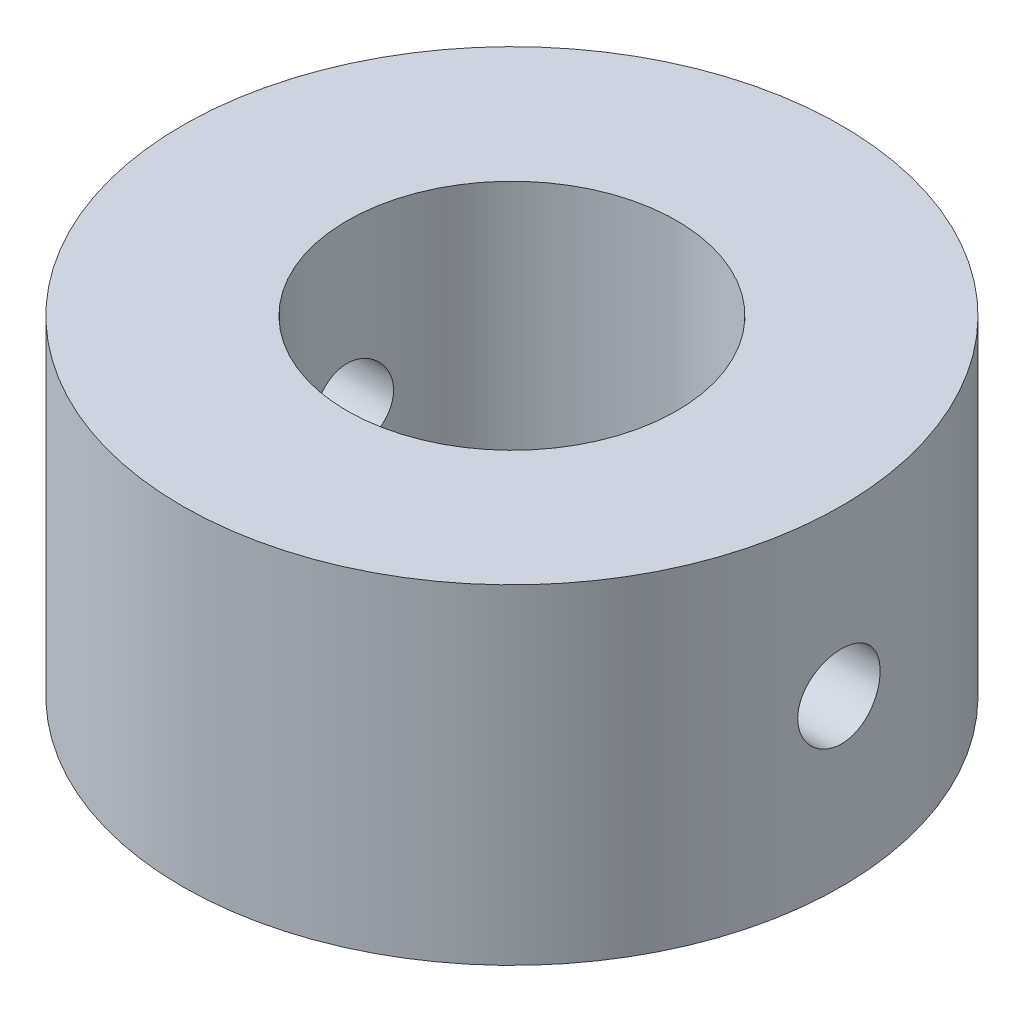
ISO-10303-21;
HEADER;
FILE_DESCRIPTION(('STEP AP214'),'2;1');
FILE_NAME('part.step','',(''),(''),'','','');
FILE_SCHEMA(('AUTOMOTIVE_DESIGN { 1 0 10303 214 1 1 1 1 }'));
ENDSEC;
DATA;
#1=APPLICATION_CONTEXT('core data for automotive mechanical design processes');
#2=APPLICATION_PROTOCOL_DEFINITION('international standard','automotive_design',2000,#1);
#3=PRODUCT_CONTEXT('',#1,'mechanical');
#4=PRODUCT('Part','Part','',(#3));
#5=PRODUCT_RELATED_PRODUCT_CATEGORY('part','',(#4));
#6=PRODUCT_DEFINITION_FORMATION('','',#4);
#7=PRODUCT_DEFINITION_CONTEXT('part definition',#1,'design');
#8=PRODUCT_DEFINITION('design','',#6,#7);
#9=PRODUCT_DEFINITION_SHAPE('','',#8);
#10=(LENGTH_UNIT() NAMED_UNIT(*) SI_UNIT(.MILLI.,.METRE.));
#11=(NAMED_UNIT(*) PLANE_ANGLE_UNIT() SI_UNIT($,.RADIAN.));
#12=(NAMED_UNIT(*) SI_UNIT($,.STERADIAN.) SOLID_ANGLE_UNIT());
#13=UNCERTAINTY_MEASURE_WITH_UNIT(LENGTH_MEASURE(1.E-05),#10,'distance_accuracy_value','');
#14=(GEOMETRIC_REPRESENTATION_CONTEXT(3) GLOBAL_UNCERTAINTY_ASSIGNED_CONTEXT((#13)) GLOBAL_UNIT_ASSIGNED_CONTEXT((#10,
#11,#12)) REPRESENTATION_CONTEXT('',''));
#15=CARTESIAN_POINT('',(0.,0.,0.));
#16=DIRECTION('',(0.,0.,1.));
#17=DIRECTION('',(1.,0.,0.));
#18=AXIS2_PLACEMENT_3D('',#15,#16,#17);
#19=CARTESIAN_POINT('',(0.,16.,0.));
#20=DIRECTION('',(0.,-1.,0.));
#21=DIRECTION('',(0.,0.,-1.));
#22=AXIS2_PLACEMENT_3D('',#19,#20,#21);
#23=CYLINDRICAL_SURFACE('',#22,16.);
#24=CARTESIAN_POINT('',(0.,16.,0.));
#25=DIRECTION('',(0.,1.,0.));
#26=DIRECTION('',(0.,0.,1.));
#27=AXIS2_PLACEMENT_3D('',#24,#25,#26);
#28=CIRCLE('',#27,16.);
#29=CARTESIAN_POINT('',(0.,16.,16.));
#30=VERTEX_POINT('',#29);
#31=EDGE_CURVE('E10',#30,#30,#28,.T.);
#32=ORIENTED_EDGE('',*,*,#31,.F.);
#33=EDGE_LOOP('',(#32));
#34=FACE_BOUND('',#33,.T.);
#35=CARTESIAN_POINT('',(0.,0.,0.));
#36=DIRECTION('',(0.,1.,0.));
#37=DIRECTION('',(0.,0.,1.));
#38=AXIS2_PLACEMENT_3D('',#35,#36,#37);
#39=CIRCLE('',#38,16.);
#40=CARTESIAN_POINT('',(0.,0.,16.));
#41=VERTEX_POINT('',#40);
#42=EDGE_CURVE('E42',#41,#41,#39,.T.);
#43=ORIENTED_EDGE('',*,*,#42,.T.);
#44=EDGE_LOOP('',(#43));
#45=FACE_BOUND('',#44,.T.);
#46=CARTESIAN_POINT('',(-15.8745078663876,8.,2.));
#47=CARTESIAN_POINT('',(-15.8745094733706,8.11186902703346,1.99999524386716));
#48=CARTESIAN_POINT('',(-15.8757031609516,8.22380797192385,1.99058231921703));
#49=CARTESIAN_POINT('',(-15.8803471278398,8.44457058032369,1.95318113097707));
#50=CARTESIAN_POINT('',(-15.8837997651437,8.55339086439763,1.92517345687303));
#51=CARTESIAN_POINT('',(-15.8925645902034,8.76468790569282,1.85142135426077));
#52=CARTESIAN_POINT('',(-15.8978755156292,8.86716891369493,1.80568896383859));
#53=CARTESIAN_POINT('',(-15.9097569881593,9.06298276145846,1.69781135874362));
#54=CARTESIAN_POINT('',(-15.9163273198743,9.15631716139445,1.63566894989983));
#55=CARTESIAN_POINT('',(-15.9300284739512,9.3317297976977,1.49636276021153));
#56=CARTESIAN_POINT('',(-15.9371619336164,9.41374944185511,1.41912545201944));
#57=CARTESIAN_POINT('',(-15.9511618630067,9.56369821515126,1.25198020853698));
#58=CARTESIAN_POINT('',(-15.9580283194351,9.63162664327575,1.16207164324643));
#59=CARTESIAN_POINT('',(-15.9707475569026,9.75167486360509,0.971767864540776));
#60=CARTESIAN_POINT('',(-15.9765969107745,9.80374163607973,0.87133895644889));
#61=CARTESIAN_POINT('',(-15.9865938956362,9.89024895995277,0.663077374444733));
#62=CARTESIAN_POINT('',(-15.9907415897838,9.92469016554121,0.555244975488723));
#63=CARTESIAN_POINT('',(-15.9968493496498,9.97479365466754,0.335836550200889));
#64=CARTESIAN_POINT('',(-15.9988207586875,9.99055334281911,0.224283087730702));
#65=CARTESIAN_POINT('',(-16.0003925578337,10.0031483080292,9.8560549236407E-05));
#66=CARTESIAN_POINT('',(-15.9999930412166,9.99998432956203,-0.112532461595818));
#67=CARTESIAN_POINT('',(-15.9968771821601,9.97489983779406,-0.335012215179639));
#68=CARTESIAN_POINT('',(-15.9941737796458,9.9530840812149,-0.444872964611563));
#69=CARTESIAN_POINT('',(-15.9867684475387,9.89147905869605,-0.659361731124301));
#70=CARTESIAN_POINT('',(-15.9820664799524,9.85168945106654,-0.763989648684965));
#71=CARTESIAN_POINT('',(-15.9711700624633,9.75515480577297,-0.965367052350913));
#72=CARTESIAN_POINT('',(-15.9649716307459,9.69836443381586,-1.06209458227242));
#73=CARTESIAN_POINT('',(-15.9517757525223,9.56947331022718,-1.24468596184518));
#74=CARTESIAN_POINT('',(-15.9447782693781,9.49737185642514,-1.33054931297389));
#75=CARTESIAN_POINT('',(-15.9307109401881,9.33931854512129,-1.48959042461836));
#76=CARTESIAN_POINT('',(-15.9236409264378,9.25327539236267,-1.5626774719968));
#77=CARTESIAN_POINT('',(-15.9102725755246,9.07009475457404,-1.69338628050009));
#78=CARTESIAN_POINT('',(-15.9039742407807,8.97295723476955,-1.75100799314808));
#79=CARTESIAN_POINT('',(-15.8928624209018,8.77026440355014,-1.84915565886619));
#80=CARTESIAN_POINT('',(-15.8880495672651,8.66470553603744,-1.88967434388986));
#81=CARTESIAN_POINT('',(-15.8804659399677,8.44820843717853,-1.95238532357447));
#82=CARTESIAN_POINT('',(-15.8776950678936,8.33727046535302,-1.9745785014397));
#83=CARTESIAN_POINT('',(-15.8745271102724,8.11396545440019,-1.99988834552689));
#84=CARTESIAN_POINT('',(-15.874114139539,8.00161310152897,-2.00313267359863));
#85=CARTESIAN_POINT('',(-15.8756667289572,7.77796645626767,-1.99078956258445));
#86=CARTESIAN_POINT('',(-15.8776322384116,7.66667214137655,-1.97520252488785));
#87=CARTESIAN_POINT('',(-15.8837058278719,7.44868338913771,-1.92574662863818));
#88=CARTESIAN_POINT('',(-15.8878066615573,7.34197470784768,-1.89193958699685));
#89=CARTESIAN_POINT('',(-15.8976829597665,7.13574067611748,-1.8070669752929));
#90=CARTESIAN_POINT('',(-15.9034584831261,7.03621557820731,-1.75600079886498));
#91=CARTESIAN_POINT('',(-15.9160714508259,6.84659628494961,-1.63774561772394));
#92=CARTESIAN_POINT('',(-15.9229143418967,6.75655466774846,-1.57047289566168));
#93=CARTESIAN_POINT('',(-15.9368739164082,6.58899475685197,-1.42183259389516));
#94=CARTESIAN_POINT('',(-15.9439906104903,6.51147695050561,-1.34046446594039));
#95=CARTESIAN_POINT('',(-15.9577447094957,6.37071665013248,-1.16538542044682));
#96=CARTESIAN_POINT('',(-15.9643791513002,6.30755804256401,-1.07160679369363));
#97=CARTESIAN_POINT('',(-15.9763769042529,6.19788942589296,-0.874698065345432));
#98=CARTESIAN_POINT('',(-15.9817402410217,6.15137908121522,-0.771568152294658));
#99=CARTESIAN_POINT('',(-15.9905783252255,6.07646577047357,-0.559163087311563));
#100=CARTESIAN_POINT('',(-15.9940581255017,6.04801432317471,-0.449905253209423));
#101=CARTESIAN_POINT('',(-15.9987580374205,6.00986872861859,-0.228116845822368));
#102=CARTESIAN_POINT('',(-15.9999782509614,6.00017373552061,-0.115586420350485));
#103=CARTESIAN_POINT('',(-16.0000210241093,5.99983206216628,0.108733746675027));
#104=CARTESIAN_POINT('',(-15.9988598653427,6.00905603154562,0.220523310171787));
#105=CARTESIAN_POINT('',(-15.9943027292635,6.04601649074467,0.440950193162091));
#106=CARTESIAN_POINT('',(-15.9909067535052,6.0737529676894,0.549587514847879));
#107=CARTESIAN_POINT('',(-15.9822598816963,6.14691049147976,0.760609154389853));
#108=CARTESIAN_POINT('',(-15.9770096354758,6.19232534349858,0.862995648127658));
#109=CARTESIAN_POINT('',(-15.9652355808503,6.29953705168604,1.05871466971522));
#110=CARTESIAN_POINT('',(-15.958711757305,6.36133410260935,1.15204708991042));
#111=CARTESIAN_POINT('',(-15.9450655514046,6.50003457226911,1.32766941437005));
#112=CARTESIAN_POINT('',(-15.9379395302314,6.57703423481892,1.40988303026744));
#113=CARTESIAN_POINT('',(-15.9239212721083,6.74375435522309,1.56027289505548));
#114=CARTESIAN_POINT('',(-15.917029090936,6.83347782199272,1.62844581423479));
#115=CARTESIAN_POINT('',(-15.9042304911575,7.02349593815789,1.74904419401283));
#116=CARTESIAN_POINT('',(-15.8983279820183,7.12383007194807,1.80140782653339));
#117=CARTESIAN_POINT('',(-15.888222864957,7.33188539247581,1.88846823067468));
#118=CARTESIAN_POINT('',(-15.884018409231,7.43959839944272,1.92318421698265));
#119=CARTESIAN_POINT('',(-15.8788062945588,7.62322398963483,1.96565271699038));
#120=CARTESIAN_POINT('',(-15.8772024121753,7.69797836123006,1.97851442480846));
#121=CARTESIAN_POINT('',(-15.8750526578393,7.84847779997354,1.99568964472441));
#122=CARTESIAN_POINT('',(-15.8745067778594,7.92422285960076,2.00000322167946));
#123=CARTESIAN_POINT('',(-15.8745078663876,8.,2.));
#124=B_SPLINE_CURVE_WITH_KNOTS('',3,(#46,#47,#48,#49,#50,#51,#52,#53,#54,#55,#56,#57,#58,#59,
#60,#61,#62,#63,#64,#65,#66,#67,#68,#69,#70,#71,#72,#73,#74,#75,#76,#77,#78,#79,#80,#81,#82,#83,
#84,#85,#86,#87,#88,#89,#90,#91,#92,#93,#94,#95,#96,#97,#98,#99,#100,#101,#102,#103,#104,#105,
#106,#107,#108,#109,#110,#111,#112,#113,#114,#115,#116,#117,#118,#119,#120,#121,#122,#123),
.UNSPECIFIED.,.T.,.F.,(4,2,2,2,2,2,2,2,2,2,2,2,2,2,2,2,2,2,2,2,2,2,2,2,2,2,2,2,2,2,2,2,2,2,2,2,
2,2,4),(0.,0.33533025398339,0.671011100921906,1.00646436206496,1.3418603036049,1.67893262039253,
2.01602170194063,2.35422548916593,2.69241672271864,3.02883677553166,3.36524359336087,
3.69977331946431,4.03430940537432,4.36974563530244,4.70519725175284,5.04294157902216,
5.3806869649554,5.71857573391207,6.05644821724951,6.39204174244707,6.72762811461693,
7.06208301034186,7.39654965769483,7.73278255635289,8.06902853595849,8.40719108713874,
8.74534682167103,9.08259085427953,9.4198196781825,9.75475053030604,10.0896811494943,
10.4244945083527,10.759311847714,11.0963210311267,11.4334100435186,11.7718007816387,
12.1098222878561,12.3369679170636,12.5641118228438),.UNSPECIFIED.);
#125=CARTESIAN_POINT('',(-15.8745078663876,8.,2.));
#126=VERTEX_POINT('',#125);
#127=EDGE_CURVE('E69',#126,#126,#124,.T.);
#128=ORIENTED_EDGE('',*,*,#127,.F.);
#129=EDGE_LOOP('',(#128));
#130=FACE_BOUND('',#129,.T.);
#131=CARTESIAN_POINT('',(16.,6.,0.));
#132=CARTESIAN_POINT('',(15.9999984391714,6.00000475274857,-0.111872876444609));
#133=CARTESIAN_POINT('',(15.9988142764392,6.00941830333543,-0.223815659442198));
#134=CARTESIAN_POINT('',(15.9942043208909,6.04682220365664,-0.444586241671802));
#135=CARTESIAN_POINT('',(15.9907761875314,6.07483195033871,-0.553410664498996));
#136=CARTESIAN_POINT('',(15.9820644883553,6.14859011513127,-0.764716459850443));
#137=CARTESIAN_POINT('',(15.9767821716444,6.19432659344788,-0.86720204811691));
#138=CARTESIAN_POINT('',(15.9649496070248,6.30221382717583,-1.06302357991443));
#139=CARTESIAN_POINT('',(15.9583995766729,6.36436176682457,-1.1563610892451));
#140=CARTESIAN_POINT('',(15.9447225704506,6.50367355987167,-1.33177025354505));
#141=CARTESIAN_POINT('',(15.9375929175393,6.58090970347699,-1.4137842919497));
#142=CARTESIAN_POINT('',(15.923581808078,6.74805025882931,-1.56372223484599));
#143=CARTESIAN_POINT('',(15.9167003641942,6.8379553159306,-1.6316454211138));
#144=CARTESIAN_POINT('',(15.9039384449567,7.02825598205253,-1.75168812902715));
#145=CARTESIAN_POINT('',(15.8980614174233,7.12868588925435,-1.80375367675286));
#146=CARTESIAN_POINT('',(15.8880090276615,7.33694964155789,-1.89025846126009));
#147=CARTESIAN_POINT('',(15.8838336009051,7.44478320571761,-1.92469836645217));
#148=CARTESIAN_POINT('',(15.8776827168289,7.66419535646941,-1.97479918401981));
#149=CARTESIAN_POINT('',(15.875695867494,7.77575140616336,-1.99055737178536));
#150=CARTESIAN_POINT('',(15.8741122251423,7.99994101077747,-2.00314843964578));
#151=CARTESIAN_POINT('',(15.8745153360121,8.11257452218503,-1.99998208080193));
#152=CARTESIAN_POINT('',(15.877655642958,8.33504386179903,-1.97489378915832));
#153=CARTESIAN_POINT('',(15.8803795036826,8.44489198896021,-1.95307901038776));
#154=CARTESIAN_POINT('',(15.887833598061,8.65935601697519,-1.89148030654564));
#155=CARTESIAN_POINT('',(15.8925638723658,8.76397181177123,-1.85169601740152));
#156=CARTESIAN_POINT('',(15.9035129269172,8.96533439921735,-1.75517244792932));
#157=CARTESIAN_POINT('',(15.9097357856916,9.06205864019919,-1.69838660296611));
#158=CARTESIAN_POINT('',(15.9229656914448,9.2446453555306,-1.56950517556553));
#159=CARTESIAN_POINT('',(15.9299727742853,9.33050733277895,-1.49740889286462));
#160=CARTESIAN_POINT('',(15.9440408791234,9.48955416857819,-1.33935928860302));
#161=CARTESIAN_POINT('',(15.9511019390951,9.56264727341278,-1.25331360627201));
#162=CARTESIAN_POINT('',(15.9644370604468,9.69336710402444,-1.07012573529114));
#163=CARTESIAN_POINT('',(15.9707111200121,9.7509937941376,-0.972983521054601));
#164=CARTESIAN_POINT('',(15.9817692177486,9.84914505637113,-0.770289337090785));
#165=CARTESIAN_POINT('',(15.9865527552123,9.88966388310498,-0.664734556270173));
#166=CARTESIAN_POINT('',(15.9940862862405,9.9523763948186,-0.448246352344845));
#167=CARTESIAN_POINT('',(15.996836375007,9.97457093770964,-0.337313181304534));
#168=CARTESIAN_POINT('',(15.9999807712861,9.99988593940844,-0.114010531130798));
#169=CARTESIAN_POINT('',(16.0003906891411,10.0031327938913,-0.00165559215888587));
#170=CARTESIAN_POINT('',(15.9988507040435,9.99079381275524,0.221996829197997));
#171=CARTESIAN_POINT('',(15.9969008513457,9.97520837819873,0.333294334051765));
#172=CARTESIAN_POINT('',(15.9908701500536,9.92575223298049,0.551299606177218));
#173=CARTESIAN_POINT('',(15.986796326511,9.89194178927789,0.658021256339765));
#174=CARTESIAN_POINT('',(15.9769737848016,9.80705803846967,0.864279723886726));
#175=CARTESIAN_POINT('',(15.971225009765,9.75598414520686,0.963816297172252));
#176=CARTESIAN_POINT('',(15.9586545832809,9.63771748999403,1.15344361654994));
#177=CARTESIAN_POINT('',(15.9518275523401,9.57044296815549,1.24348300795505));
#178=CARTESIAN_POINT('',(15.9378811386053,9.42180040197264,1.41103759170105));
#179=CARTESIAN_POINT('',(15.9307617442152,9.34043179819921,1.48855228666949));
#180=CARTESIAN_POINT('',(15.9169848437007,9.16535406659429,1.62930556705441));
#181=CARTESIAN_POINT('',(15.9103301977706,9.07157732295168,1.69246036845435));
#182=CARTESIAN_POINT('',(15.8982832882972,8.87467340411623,1.8021223115548));
#183=CARTESIAN_POINT('',(15.8928909994482,8.77154641641879,1.84862978698269));
#184=CARTESIAN_POINT('',(15.883998803144,8.55913974468191,1.92354126309323));
#185=CARTESIAN_POINT('',(15.8804939614783,8.44987693596162,1.95199250196569));
#186=CARTESIAN_POINT('',(15.8757593272596,8.22807801297547,1.99013599509428));
#187=CARTESIAN_POINT('',(15.8745294288702,8.1155420512328,1.99982912202861));
#188=CARTESIAN_POINT('',(15.8744870158597,7.89122485663626,2.00016522886787));
#189=CARTESIAN_POINT('',(15.8756577980156,7.77944380133449,1.99093983815942));
#190=CARTESIAN_POINT('',(15.8802489162976,7.55903429652394,1.95397952387946));
#191=CARTESIAN_POINT('',(15.8836692526647,7.45040584735296,1.92624459832462));
#192=CARTESIAN_POINT('',(15.8923689261964,7.23940243458688,1.85309365895172));
#193=CARTESIAN_POINT('',(15.8976475967423,7.13702524398255,1.80768398477675));
#194=CARTESIAN_POINT('',(15.9094702659586,6.94132267676135,1.70048552172025));
#195=CARTESIAN_POINT('',(15.9160142804833,6.84799741358414,1.63869652760767));
#196=CARTESIAN_POINT('',(15.9296848380179,6.67237501972762,1.50000506501267));
#197=CARTESIAN_POINT('',(15.9368149766723,6.59015563123602,1.42300450061997));
#198=CARTESIAN_POINT('',(15.9508226527432,6.43975453986562,1.25628018157471));
#199=CARTESIAN_POINT('',(15.9577001302047,6.37157615138055,1.16655343131325));
#200=CARTESIAN_POINT('',(15.970456452694,6.25097171431577,0.976532496683369));
#201=CARTESIAN_POINT('',(15.9763314006264,6.1986065552806,0.876199423676936));
#202=CARTESIAN_POINT('',(15.9863811926138,6.11154300566698,0.668146321841025));
#203=CARTESIAN_POINT('',(15.9905578829566,6.07682541891723,0.560434464696189));
#204=CARTESIAN_POINT('',(15.995733762622,6.03435252946296,0.376804617574339));
#205=CARTESIAN_POINT('',(15.9973258071636,6.02148884641435,0.302044530813536));
#206=CARTESIAN_POINT('',(15.9994594506335,6.00431100344542,0.151533650569948));
#207=CARTESIAN_POINT('',(16.0000010573078,5.99999678048056,0.0757828643968218));
#208=CARTESIAN_POINT('',(16.,6.,0.));
#209=B_SPLINE_CURVE_WITH_KNOTS('',3,(#131,#132,#133,#134,#135,#136,#137,#138,#139,#140,#141,
#142,#143,#144,#145,#146,#147,#148,#149,#150,#151,#152,#153,#154,#155,#156,#157,#158,#159,#160,
#161,#162,#163,#164,#165,#166,#167,#168,#169,#170,#171,#172,#173,#174,#175,#176,#177,#178,#179,
#180,#181,#182,#183,#184,#185,#186,#187,#188,#189,#190,#191,#192,#193,#194,#195,#196,#197,#198,
#199,#200,#201,#202,#203,#204,#205,#206,#207,#208),.UNSPECIFIED.,.T.,.F.,(4,2,2,2,2,2,2,2,2,2,2,
2,2,2,2,2,2,2,2,2,2,2,2,2,2,2,2,2,2,2,2,2,2,2,2,2,2,2,4),(0.,0.335341818220998,
0.671033968754742,1.00650040654542,1.34190932472858,1.67896650561474,2.01604086240008,
2.35425000255095,2.69244631597446,3.02887380229057,3.36528775907731,3.69978157153354,
4.03428216132993,4.36970741028427,4.70514800410911,5.04290782509133,5.38066842490491,
5.71854236585284,6.05640048723024,6.39200223513537,6.72759683601543,7.06208843114717,
7.39659138463158,7.73281922342738,8.06906041100071,8.40721577206059,8.74536435377231,
9.0826245942474,9.41986914408499,9.75477520961772,10.0896813110364,10.4244673976519,
10.7592576792981,11.0962819015346,11.4333855877601,11.7717712242948,12.1097879894723,
12.336950745501,12.5641118264035),.UNSPECIFIED.);
#210=CARTESIAN_POINT('',(16.,6.,0.));
#211=VERTEX_POINT('',#210);
#212=EDGE_CURVE('E73',#211,#211,#209,.T.);
#213=ORIENTED_EDGE('',*,*,#212,.F.);
#214=EDGE_LOOP('',(#213));
#215=FACE_BOUND('',#214,.T.);
#216=ADVANCED_FACE('F30',(#34,#45,#130,#215),#23,.T.);
#217=CARTESIAN_POINT('',(0.,16.,0.));
#218=DIRECTION('',(0.,-1.,0.));
#219=DIRECTION('',(0.,0.,-1.));
#220=AXIS2_PLACEMENT_3D('',#217,#218,#219);
#221=CYLINDRICAL_SURFACE('',#220,8.);
#222=CARTESIAN_POINT('',(-7.74596669241483,8.,2.));
#223=CARTESIAN_POINT('',(-7.74596880070288,8.11044060074126,1.99999686287446));
#224=CARTESIAN_POINT('',(-7.74835444811678,8.22091591894282,1.99082099639812));
#225=CARTESIAN_POINT('',(-7.75761489594051,8.43869406253881,1.95441850037103));
#226=CARTESIAN_POINT('',(-7.76449230897304,8.54599500357455,1.92718136539368));
#227=CARTESIAN_POINT('',(-7.7819097967692,8.75424283054974,1.85559295970563));
#228=CARTESIAN_POINT('',(-7.79244514152366,8.85519772430857,1.81126378228359));
#229=CARTESIAN_POINT('',(-7.81598553623007,9.04824868203191,1.70681691300911));
#230=CARTESIAN_POINT('',(-7.82899069102791,9.14034436966417,1.64669855084855));
#231=CARTESIAN_POINT('',(-7.856325730845,9.31508931620977,1.5109667418495));
#232=CARTESIAN_POINT('',(-7.87067678098427,9.39751488028004,1.43506951016324));
#233=CARTESIAN_POINT('',(-7.89890300412235,9.54860911548827,1.27054565128053));
#234=CARTESIAN_POINT('',(-7.91277813253111,9.6172765004974,1.18191783534425));
#235=CARTESIAN_POINT('',(-7.93872332416466,9.73982037410502,0.992916160863164));
#236=CARTESIAN_POINT('',(-7.95076549920474,9.79347711052917,0.892395660956097));
#237=CARTESIAN_POINT('',(-7.97144649540787,9.88304771532247,0.683410547434211));
#238=CARTESIAN_POINT('',(-7.98008581867475,9.91896420153241,0.574947108633554));
#239=CARTESIAN_POINT('',(-7.99283807078544,9.97131826766287,0.355487007003331));
#240=CARTESIAN_POINT('',(-7.99703915075451,9.98813571546127,0.244586175639182));
#241=CARTESIAN_POINT('',(-8.00074875285838,10.0030067034204,0.0214630554102164));
#242=CARTESIAN_POINT('',(-8.00025796877363,10.0010630177677,-0.0907590356304541));
#243=CARTESIAN_POINT('',(-7.99470475962828,9.97874011979989,-0.310704494344773));
#244=CARTESIAN_POINT('',(-7.98974401872699,9.95877093995692,-0.418472431202132));
#245=CARTESIAN_POINT('',(-7.97592669219883,9.9016229839612,-0.629076494827371));
#246=CARTESIAN_POINT('',(-7.96706989918753,9.86444329169807,-0.731912358740875));
#247=CARTESIAN_POINT('',(-7.94630007760717,9.77359794345035,-0.930813407003612));
#248=CARTESIAN_POINT('',(-7.93436015756043,9.7197863642706,-1.02680901953301));
#249=CARTESIAN_POINT('',(-7.90871923047719,9.59731545670699,-1.20855124468098));
#250=CARTESIAN_POINT('',(-7.89501791721992,9.5286535451515,-1.29429607017101));
#251=CARTESIAN_POINT('',(-7.86690971015616,9.3762330064141,-1.45554807016991));
#252=CARTESIAN_POINT('',(-7.85249375620734,9.29211608612178,-1.5307153581504));
#253=CARTESIAN_POINT('',(-7.82492034813365,9.1123200211678,-1.66595275192604));
#254=CARTESIAN_POINT('',(-7.81176295284776,9.0166403364072,-1.72602215209203));
#255=CARTESIAN_POINT('',(-7.78816397465319,8.81576797268083,-1.82957625804519));
#256=CARTESIAN_POINT('',(-7.77773586980577,8.71053141574945,-1.87297913394098));
#257=CARTESIAN_POINT('',(-7.76094912111966,8.49393162553884,-1.94137124127268));
#258=CARTESIAN_POINT('',(-7.75458960648175,8.38256970881349,-1.96636441310582));
#259=CARTESIAN_POINT('',(-7.74684284831312,8.1600323987815,-1.99666371093214));
#260=CARTESIAN_POINT('',(-7.74532871274918,8.0489297653363,-2.0024723791357));
#261=CARTESIAN_POINT('',(-7.74709874784831,7.82734245073747,-1.99561359241244));
#262=CARTESIAN_POINT('',(-7.75038247681013,7.71685771363901,-1.98294783827904));
#263=CARTESIAN_POINT('',(-7.76125665563648,7.50150858803624,-1.93994037115013));
#264=CARTESIAN_POINT('',(-7.768775761875,7.39658181874333,-1.9098912546254));
#265=CARTESIAN_POINT('',(-7.7872057461677,7.19325483371866,-1.8332944653365));
#266=CARTESIAN_POINT('',(-7.79811702598891,7.09485539275573,-1.78674483817004));
#267=CARTESIAN_POINT('',(-7.8223690967461,6.90524697770612,-1.67741653434925));
#268=CARTESIAN_POINT('',(-7.83575334885313,6.81421692796552,-1.6143374030685));
#269=CARTESIAN_POINT('',(-7.86333666457373,6.64384930975892,-1.47412058586891));
#270=CARTESIAN_POINT('',(-7.87753586182776,6.56451366667994,-1.39698058961088));
#271=CARTESIAN_POINT('',(-7.90557922425285,6.41775116594324,-1.22852544196945));
#272=CARTESIAN_POINT('',(-7.91940561649468,6.35067194996095,-1.13690390506319));
#273=CARTESIAN_POINT('',(-7.94477773290987,6.23285130643901,-0.943405365389351));
#274=CARTESIAN_POINT('',(-7.95632357603169,6.18210902671344,-0.841528897915183));
#275=CARTESIAN_POINT('',(-7.9757609259065,6.09884317237765,-0.631116403462182));
#276=CARTESIAN_POINT('',(-7.98367864017925,6.06618857249675,-0.522634762055765));
#277=CARTESIAN_POINT('',(-7.99508234716634,6.01963173231327,-0.301499520637615));
#278=CARTESIAN_POINT('',(-7.99856919514738,6.00572587300877,-0.188846730082482));
#279=CARTESIAN_POINT('',(-8.00068338817612,5.99726482084892,0.0341670528866451));
#280=CARTESIAN_POINT('',(-7.99943957759977,6.00219658180918,0.144507653932042));
#281=CARTESIAN_POINT('',(-7.99251792914887,6.0300956545887,0.3627349928295));
#282=CARTESIAN_POINT('',(-7.98684022314338,6.05306243002634,0.470621803561856));
#283=CARTESIAN_POINT('',(-7.97170865707778,6.11610443954172,0.680342071289547));
#284=CARTESIAN_POINT('',(-7.96227529004785,6.15608690662876,0.782204989161725));
#285=CARTESIAN_POINT('',(-7.94062577827316,6.25194115803914,0.977834106083248));
#286=CARTESIAN_POINT('',(-7.92840928277515,6.30781494534097,1.07159928253127));
#287=CARTESIAN_POINT('',(-7.90214499360574,6.43543046799227,1.25080385684661));
#288=CARTESIAN_POINT('',(-7.88806033883329,6.50752028580766,1.33598997659667));
#289=CARTESIAN_POINT('',(-7.85981298114379,6.66484570395469,1.49323004054701));
#290=CARTESIAN_POINT('',(-7.84565025934604,6.75008463222232,1.56528065015318));
#291=CARTESIAN_POINT('',(-7.81854951691005,6.93320282837892,1.69552405294366));
#292=CARTESIAN_POINT('',(-7.80563927346578,7.03128824673051,1.75343323883276));
#293=CARTESIAN_POINT('',(-7.78287910989656,7.23611097974964,1.85185379317094));
#294=CARTESIAN_POINT('',(-7.77302696466427,7.34284193218769,1.8923778195043));
#295=CARTESIAN_POINT('',(-7.75903817501475,7.54115402367032,1.948845057142));
#296=CARTESIAN_POINT('',(-7.75417326006998,7.63178632877227,1.96798634119376));
#297=CARTESIAN_POINT('',(-7.7476367716524,7.81493773799538,1.99356458514354));
#298=CARTESIAN_POINT('',(-7.74596492578215,7.9074566804888,2.0000026287435));
#299=CARTESIAN_POINT('',(-7.74596669241483,8.,2.));
#300=B_SPLINE_CURVE_WITH_KNOTS('',3,(#222,#223,#224,#225,#226,#227,#228,#229,#230,#231,#232,
#233,#234,#235,#236,#237,#238,#239,#240,#241,#242,#243,#244,#245,#246,#247,#248,#249,#250,#251,
#252,#253,#254,#255,#256,#257,#258,#259,#260,#261,#262,#263,#264,#265,#266,#267,#268,#269,#270,
#271,#272,#273,#274,#275,#276,#277,#278,#279,#280,#281,#282,#283,#284,#285,#286,#287,#288,#289,
#290,#291,#292,#293,#294,#295,#296,#297,#298,#299),.UNSPECIFIED.,.T.,.F.,(4,2,2,2,2,2,2,2,2,2,2,
2,2,2,2,2,2,2,2,2,2,2,2,2,2,2,2,2,2,2,2,2,2,2,2,2,2,2,4),(0.,0.330981953388908,
0.662156593142932,0.992904581732815,1.32366661404383,1.66099163354381,1.99834817183893,
2.34041197118336,2.68242527877674,3.01751000796277,3.35254518932816,3.68014610151157,
4.00776445379829,4.33834299403555,4.6689790837513,5.00856373257529,5.34816424959841,
5.68941145606722,6.03058560103638,6.36274859809374,6.69488101747042,7.02157924007365,
7.34831617137134,7.68146276687326,8.01466415108036,8.35620264772255,8.69772332575643,
9.03673658245543,9.3756843912723,9.70546756901965,10.0352409390158,10.3632390124777,
10.6912784459046,11.0271767726566,11.3631602525241,11.7054118182895,12.0474137709606,
12.3247826174462,12.6021278008238),.UNSPECIFIED.);
#301=CARTESIAN_POINT('',(-7.74596669241483,8.,2.));
#302=VERTEX_POINT('',#301);
#303=EDGE_CURVE('E52',#302,#302,#300,.T.);
#304=ORIENTED_EDGE('',*,*,#303,.T.);
#305=EDGE_LOOP('',(#304));
#306=FACE_BOUND('',#305,.T.);
#307=CARTESIAN_POINT('',(0.,16.,0.));
#308=DIRECTION('',(0.,1.,0.));
#309=DIRECTION('',(0.,0.,1.));
#310=AXIS2_PLACEMENT_3D('',#307,#308,#309);
#311=CIRCLE('',#310,8.);
#312=CARTESIAN_POINT('',(0.,16.,8.));
#313=VERTEX_POINT('',#312);
#314=EDGE_CURVE('E47',#313,#313,#311,.T.);
#315=ORIENTED_EDGE('',*,*,#314,.T.);
#316=EDGE_LOOP('',(#315));
#317=FACE_BOUND('',#316,.T.);
#318=CARTESIAN_POINT('',(0.,0.,0.));
#319=DIRECTION('',(0.,1.,0.));
#320=DIRECTION('',(0.,0.,1.));
#321=AXIS2_PLACEMENT_3D('',#318,#319,#320);
#322=CIRCLE('',#321,8.);
#323=CARTESIAN_POINT('',(0.,0.,8.));
#324=VERTEX_POINT('',#323);
#325=EDGE_CURVE('E50',#324,#324,#322,.T.);
#326=ORIENTED_EDGE('',*,*,#325,.F.);
#327=EDGE_LOOP('',(#326));
#328=FACE_BOUND('',#327,.T.);
#329=CARTESIAN_POINT('',(7.74596669241483,8.,2.));
#330=CARTESIAN_POINT('',(7.74596880070288,7.88955939925874,1.99999686287446));
#331=CARTESIAN_POINT('',(7.74835444811678,7.77908408105718,1.99082099639812));
#332=CARTESIAN_POINT('',(7.75761489594051,7.56130593746119,1.95441850037103));
#333=CARTESIAN_POINT('',(7.76449230897304,7.45400499642545,1.92718136539368));
#334=CARTESIAN_POINT('',(7.7819097967692,7.24575716945025,1.85559295970563));
#335=CARTESIAN_POINT('',(7.79244514152366,7.14480227569143,1.81126378228359));
#336=CARTESIAN_POINT('',(7.81598553623007,6.9517513179681,1.70681691300911));
#337=CARTESIAN_POINT('',(7.82899069102791,6.85965563033583,1.64669855084855));
#338=CARTESIAN_POINT('',(7.856325730845,6.68491068379023,1.51096674184951));
#339=CARTESIAN_POINT('',(7.87067678098427,6.60248511971996,1.43506951016324));
#340=CARTESIAN_POINT('',(7.89890300412235,6.45139088451173,1.27054565128053));
#341=CARTESIAN_POINT('',(7.91277813253111,6.3827234995026,1.18191783534425));
#342=CARTESIAN_POINT('',(7.93872332416466,6.26017962589498,0.992916160863165));
#343=CARTESIAN_POINT('',(7.95076549920474,6.20652288947083,0.892395660956097));
#344=CARTESIAN_POINT('',(7.97144649540787,6.11695228467753,0.683410547434211));
#345=CARTESIAN_POINT('',(7.98008581867475,6.08103579846759,0.574947108633553));
#346=CARTESIAN_POINT('',(7.99283807078544,6.02868173233713,0.355487007003329));
#347=CARTESIAN_POINT('',(7.99703915075451,6.01186428453873,0.24458617563918));
#348=CARTESIAN_POINT('',(8.00074875285838,5.99699329657956,0.0214630554102154));
#349=CARTESIAN_POINT('',(8.00025796877363,5.99893698223232,-0.0907590356304549));
#350=CARTESIAN_POINT('',(7.99470475962828,6.02125988020012,-0.310704494344775));
#351=CARTESIAN_POINT('',(7.98974401872699,6.04122906004308,-0.418472431202134));
#352=CARTESIAN_POINT('',(7.97592669219883,6.0983770160388,-0.629076494827372));
#353=CARTESIAN_POINT('',(7.96706989918753,6.13555670830193,-0.731912358740875));
#354=CARTESIAN_POINT('',(7.94630007760717,6.22640205654965,-0.930813407003613));
#355=CARTESIAN_POINT('',(7.93436015756043,6.2802136357294,-1.02680901953301));
#356=CARTESIAN_POINT('',(7.90871923047719,6.40268454329301,-1.20855124468098));
#357=CARTESIAN_POINT('',(7.89501791721992,6.4713464548485,-1.29429607017101));
#358=CARTESIAN_POINT('',(7.86690971015616,6.6237669935859,-1.45554807016991));
#359=CARTESIAN_POINT('',(7.85249375620734,6.70788391387822,-1.5307153581504));
#360=CARTESIAN_POINT('',(7.82492034813365,6.8876799788322,-1.66595275192604));
#361=CARTESIAN_POINT('',(7.81176295284776,6.9833596635928,-1.72602215209203));
#362=CARTESIAN_POINT('',(7.78816397465319,7.18423202731917,-1.8295762580452));
#363=CARTESIAN_POINT('',(7.77773586980577,7.28946858425056,-1.87297913394098));
#364=CARTESIAN_POINT('',(7.76094912111966,7.50606837446116,-1.94137124127268));
#365=CARTESIAN_POINT('',(7.75458960648175,7.61743029118651,-1.96636441310582));
#366=CARTESIAN_POINT('',(7.74684284831313,7.8399676012185,-1.99666371093214));
#367=CARTESIAN_POINT('',(7.74532871274919,7.9510702346637,-2.0024723791357));
#368=CARTESIAN_POINT('',(7.74709874784831,8.17265754926253,-1.99561359241244));
#369=CARTESIAN_POINT('',(7.75038247681013,8.28314228636099,-1.98294783827904));
#370=CARTESIAN_POINT('',(7.76125665563648,8.49849141196377,-1.93994037115013));
#371=CARTESIAN_POINT('',(7.768775761875,8.60341818125668,-1.9098912546254));
#372=CARTESIAN_POINT('',(7.7872057461677,8.80674516628135,-1.8332944653365));
#373=CARTESIAN_POINT('',(7.79811702598891,8.90514460724427,-1.78674483817004));
#374=CARTESIAN_POINT('',(7.8223690967461,9.09475302229388,-1.67741653434925));
#375=CARTESIAN_POINT('',(7.83575334885313,9.18578307203448,-1.6143374030685));
#376=CARTESIAN_POINT('',(7.86333666457373,9.35615069024108,-1.47412058586891));
#377=CARTESIAN_POINT('',(7.87753586182776,9.43548633332006,-1.39698058961088));
#378=CARTESIAN_POINT('',(7.90557922425285,9.58224883405677,-1.22852544196945));
#379=CARTESIAN_POINT('',(7.91940561649468,9.64932805003905,-1.13690390506318));
#380=CARTESIAN_POINT('',(7.94477773290987,9.76714869356099,-0.94340536538935));
#381=CARTESIAN_POINT('',(7.95632357603169,9.81789097328656,-0.841528897915181));
#382=CARTESIAN_POINT('',(7.9757609259065,9.90115682762235,-0.631116403462181));
#383=CARTESIAN_POINT('',(7.98367864017925,9.93381142750325,-0.522634762055765));
#384=CARTESIAN_POINT('',(7.99508234716634,9.98036826768673,-0.301499520637615));
#385=CARTESIAN_POINT('',(7.99856919514738,9.99427412699123,-0.188846730082481));
#386=CARTESIAN_POINT('',(8.00068338817612,10.0027351791511,0.0341670528866464));
#387=CARTESIAN_POINT('',(7.99943957759977,9.99780341819082,0.144507653932044));
#388=CARTESIAN_POINT('',(7.99251792914887,9.9699043454113,0.362734992829502));
#389=CARTESIAN_POINT('',(7.98684022314338,9.94693756997366,0.470621803561857));
#390=CARTESIAN_POINT('',(7.97170865707778,9.88389556045828,0.680342071289548));
#391=CARTESIAN_POINT('',(7.96227529004785,9.84391309337124,0.782204989161725));
#392=CARTESIAN_POINT('',(7.94062577827316,9.74805884196086,0.977834106083247));
#393=CARTESIAN_POINT('',(7.92840928277515,9.69218505465903,1.07159928253127));
#394=CARTESIAN_POINT('',(7.90214499360574,9.56456953200773,1.25080385684661));
#395=CARTESIAN_POINT('',(7.88806033883329,9.49247971419234,1.33598997659667));
#396=CARTESIAN_POINT('',(7.85981298114379,9.33515429604531,1.49323004054701));
#397=CARTESIAN_POINT('',(7.84565025934605,9.24991536777767,1.56528065015318));
#398=CARTESIAN_POINT('',(7.81854951691005,9.06679717162108,1.69552405294366));
#399=CARTESIAN_POINT('',(7.80563927346578,8.96871175326949,1.75343323883276));
#400=CARTESIAN_POINT('',(7.78287910989656,8.76388902025036,1.85185379317094));
#401=CARTESIAN_POINT('',(7.77302696466428,8.65715806781231,1.8923778195043));
#402=CARTESIAN_POINT('',(7.75903817501475,8.45884597632968,1.94884505714201));
#403=CARTESIAN_POINT('',(7.75417326006998,8.36821367122772,1.96798634119376));
#404=CARTESIAN_POINT('',(7.7476367716524,8.18506226200462,1.99356458514354));
#405=CARTESIAN_POINT('',(7.74596492578215,8.0925433195112,2.0000026287435));
#406=CARTESIAN_POINT('',(7.74596669241483,8.,2.));
#407=B_SPLINE_CURVE_WITH_KNOTS('',3,(#329,#330,#331,#332,#333,#334,#335,#336,#337,#338,#339,
#340,#341,#342,#343,#344,#345,#346,#347,#348,#349,#350,#351,#352,#353,#354,#355,#356,#357,#358,
#359,#360,#361,#362,#363,#364,#365,#366,#367,#368,#369,#370,#371,#372,#373,#374,#375,#376,#377,
#378,#379,#380,#381,#382,#383,#384,#385,#386,#387,#388,#389,#390,#391,#392,#393,#394,#395,#396,
#397,#398,#399,#400,#401,#402,#403,#404,#405,#406),.UNSPECIFIED.,.T.,.F.,(4,2,2,2,2,2,2,2,2,2,2,
2,2,2,2,2,2,2,2,2,2,2,2,2,2,2,2,2,2,2,2,2,2,2,2,2,2,2,4),(0.,0.330981953388909,
0.662156593142932,0.992904581732816,1.32366661404383,1.66099163354381,1.99834817183893,
2.34041197118336,2.68242527877674,3.01751000796277,3.35254518932816,3.68014610151158,
4.00776445379829,4.33834299403556,4.66897908375131,5.00856373257529,5.34816424959842,
5.68941145606722,6.03058560103638,6.36274859809374,6.69488101747042,7.02157924007366,
7.34831617137134,7.68146276687326,8.01466415108036,8.35620264772255,8.69772332575643,
9.03673658245543,9.37568439127231,9.70546756901966,10.0352409390158,10.3632390124777,
10.6912784459046,11.0271767726566,11.3631602525241,11.7054118182895,12.0474137709606,
12.3247826174462,12.6021278008238),.UNSPECIFIED.);
#408=CARTESIAN_POINT('',(7.74596669241483,8.,2.));
#409=VERTEX_POINT('',#408);
#410=EDGE_CURVE('E34',#409,#409,#407,.T.);
#411=ORIENTED_EDGE('',*,*,#410,.T.);
#412=EDGE_LOOP('',(#411));
#413=FACE_BOUND('',#412,.T.);
#414=ADVANCED_FACE('F56',(#306,#317,#328,#413),#221,.F.);
#415=CARTESIAN_POINT('',(0.,16.,0.));
#416=DIRECTION('',(0.,1.,0.));
#417=DIRECTION('',(0.,0.,1.));
#418=AXIS2_PLACEMENT_3D('',#415,#416,#417);
#419=PLANE('',#418);
#420=ORIENTED_EDGE('',*,*,#31,.T.);
#421=EDGE_LOOP('',(#420));
#422=FACE_BOUND('',#421,.T.);
#423=ORIENTED_EDGE('',*,*,#314,.F.);
#424=EDGE_LOOP('',(#423));
#425=FACE_BOUND('',#424,.T.);
#426=ADVANCED_FACE('F87',(#422,#425),#419,.T.);
#427=CARTESIAN_POINT('',(0.,0.,0.));
#428=DIRECTION('',(0.,1.,0.));
#429=DIRECTION('',(0.,0.,1.));
#430=AXIS2_PLACEMENT_3D('',#427,#428,#429);
#431=PLANE('',#430);
#432=ORIENTED_EDGE('',*,*,#42,.F.);
#433=EDGE_LOOP('',(#432));
#434=FACE_BOUND('',#433,.T.);
#435=ORIENTED_EDGE('',*,*,#325,.T.);
#436=EDGE_LOOP('',(#435));
#437=FACE_BOUND('',#436,.T.);
#438=ADVANCED_FACE('F83',(#434,#437),#431,.F.);
#439=CARTESIAN_POINT('',(16.,8.,0.));
#440=DIRECTION('',(-1.,0.,0.));
#441=DIRECTION('',(0.,0.,1.));
#442=AXIS2_PLACEMENT_3D('',#439,#440,#441);
#443=CYLINDRICAL_SURFACE('',#442,2.);
#444=ORIENTED_EDGE('',*,*,#303,.F.);
#445=EDGE_LOOP('',(#444));
#446=FACE_BOUND('',#445,.T.);
#447=ORIENTED_EDGE('',*,*,#127,.T.);
#448=EDGE_LOOP('',(#447));
#449=FACE_BOUND('',#448,.T.);
#450=ADVANCED_FACE('F62',(#446,#449),#443,.F.);
#451=ORIENTED_EDGE('',*,*,#410,.F.);
#452=EDGE_LOOP('',(#451));
#453=FACE_BOUND('',#452,.T.);
#454=ORIENTED_EDGE('',*,*,#212,.T.);
#455=EDGE_LOOP('',(#454));
#456=FACE_BOUND('',#455,.T.);
#457=ADVANCED_FACE('F59',(#453,#456),#443,.F.);
#458=CLOSED_SHELL('',(#216,#414,#426,#438,#450,#457));
#459=MANIFOLD_SOLID_BREP('B2',#458);
#460=ADVANCED_BREP_SHAPE_REPRESENTATION('',(#18,#459),#14);
#461=SHAPE_DEFINITION_REPRESENTATION(#9,#460);
ENDSEC;
END-ISO-10303-21;
